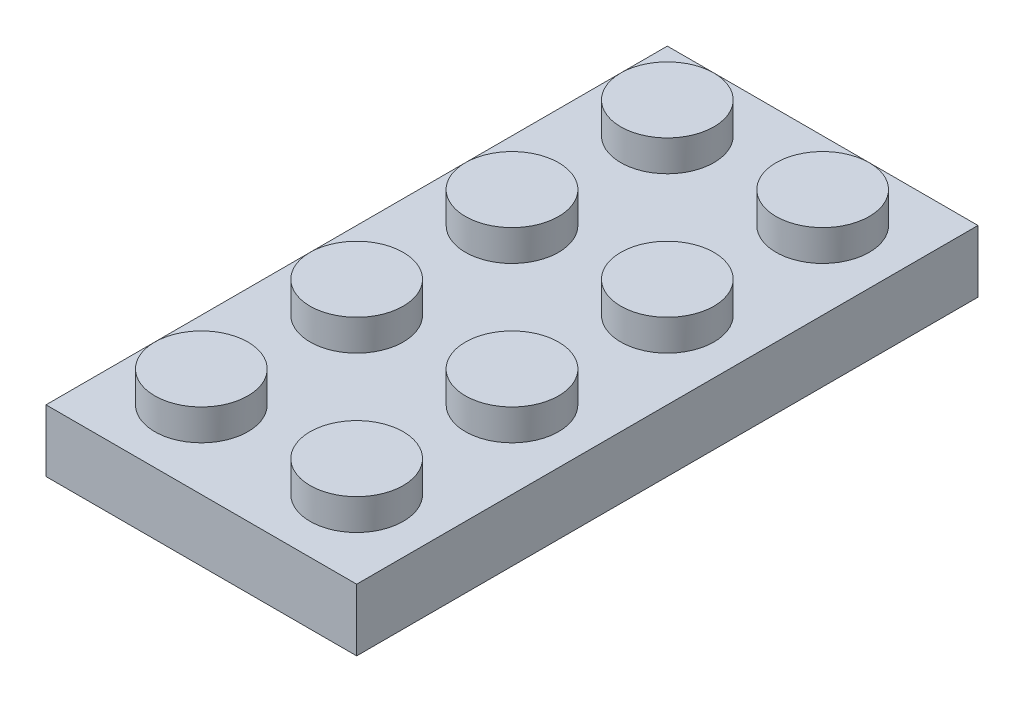
ISO-10303-21;
HEADER;
FILE_DESCRIPTION(('STEP AP214'),'2;1');
FILE_NAME('part.step','',(''),(''),'','','');
FILE_SCHEMA(('AUTOMOTIVE_DESIGN { 1 0 10303 214 1 1 1 1 }'));
ENDSEC;
DATA;
#1=APPLICATION_CONTEXT('core data for automotive mechanical design processes');
#2=APPLICATION_PROTOCOL_DEFINITION('international standard','automotive_design',2000,#1);
#3=PRODUCT_CONTEXT('',#1,'mechanical');
#4=PRODUCT('Part','Part','',(#3));
#5=PRODUCT_RELATED_PRODUCT_CATEGORY('part','',(#4));
#6=PRODUCT_DEFINITION_FORMATION('','',#4);
#7=PRODUCT_DEFINITION_CONTEXT('part definition',#1,'design');
#8=PRODUCT_DEFINITION('design','',#6,#7);
#9=PRODUCT_DEFINITION_SHAPE('','',#8);
#10=(LENGTH_UNIT() NAMED_UNIT(*) SI_UNIT(.MILLI.,.METRE.));
#11=(NAMED_UNIT(*) PLANE_ANGLE_UNIT() SI_UNIT($,.RADIAN.));
#12=(NAMED_UNIT(*) SI_UNIT($,.STERADIAN.) SOLID_ANGLE_UNIT());
#13=UNCERTAINTY_MEASURE_WITH_UNIT(LENGTH_MEASURE(1.E-05),#10,'distance_accuracy_value','');
#14=(GEOMETRIC_REPRESENTATION_CONTEXT(3) GLOBAL_UNCERTAINTY_ASSIGNED_CONTEXT((#13)) GLOBAL_UNIT_ASSIGNED_CONTEXT((#10,
#11,#12)) REPRESENTATION_CONTEXT('',''));
#15=CARTESIAN_POINT('',(0.,0.,0.));
#16=DIRECTION('',(0.,0.,1.));
#17=DIRECTION('',(1.,0.,0.));
#18=AXIS2_PLACEMENT_3D('',#15,#16,#17);
#19=CARTESIAN_POINT('',(0.,0.,0.));
#20=DIRECTION('',(0.,-1.,0.));
#21=DIRECTION('',(0.,0.,-1.));
#22=AXIS2_PLACEMENT_3D('',#19,#20,#21);
#23=PLANE('',#22);
#24=DIRECTION('',(0.,0.,1.));
#25=VECTOR('',#24,1.);
#26=CARTESIAN_POINT('',(0.,0.,0.));
#27=LINE('',#26,#25);
#28=CARTESIAN_POINT('',(0.,0.,-32.));
#29=VERTEX_POINT('',#28);
#30=CARTESIAN_POINT('',(0.,0.,0.));
#31=VERTEX_POINT('',#30);
#32=EDGE_CURVE('E224',#29,#31,#27,.T.);
#33=ORIENTED_EDGE('',*,*,#32,.F.);
#34=DIRECTION('',(-1.,0.,0.));
#35=VECTOR('',#34,1.);
#36=CARTESIAN_POINT('',(0.,0.,-32.));
#37=LINE('',#36,#35);
#38=CARTESIAN_POINT('',(16.,0.,-32.));
#39=VERTEX_POINT('',#38);
#40=EDGE_CURVE('E85',#39,#29,#37,.T.);
#41=ORIENTED_EDGE('',*,*,#40,.F.);
#42=DIRECTION('',(0.,0.,-1.));
#43=VECTOR('',#42,1.);
#44=CARTESIAN_POINT('',(16.,0.,0.));
#45=LINE('',#44,#43);
#46=CARTESIAN_POINT('',(16.,0.,0.));
#47=VERTEX_POINT('',#46);
#48=EDGE_CURVE('E242',#47,#39,#45,.T.);
#49=ORIENTED_EDGE('',*,*,#48,.F.);
#50=DIRECTION('',(1.,0.,0.));
#51=VECTOR('',#50,1.);
#52=CARTESIAN_POINT('',(0.,0.,0.));
#53=LINE('',#52,#51);
#54=EDGE_CURVE('E239',#31,#47,#53,.T.);
#55=ORIENTED_EDGE('',*,*,#54,.F.);
#56=EDGE_LOOP('',(#33,#41,#49,#55));
#57=FACE_BOUND('',#56,.T.);
#58=DIRECTION('',(-1.,0.,0.));
#59=VECTOR('',#58,1.);
#60=CARTESIAN_POINT('',(0.,0.,-30.4));
#61=LINE('',#60,#59);
#62=CARTESIAN_POINT('',(14.4,0.,-30.4));
#63=VERTEX_POINT('',#62);
#64=CARTESIAN_POINT('',(1.6,0.,-30.4));
#65=VERTEX_POINT('',#64);
#66=EDGE_CURVE('E207',#63,#65,#61,.T.);
#67=ORIENTED_EDGE('',*,*,#66,.T.);
#68=DIRECTION('',(0.,0.,1.));
#69=VECTOR('',#68,1.);
#70=CARTESIAN_POINT('',(1.6,0.,0.));
#71=LINE('',#70,#69);
#72=CARTESIAN_POINT('',(1.6,0.,-1.6));
#73=VERTEX_POINT('',#72);
#74=EDGE_CURVE('E198',#65,#73,#71,.T.);
#75=ORIENTED_EDGE('',*,*,#74,.T.);
#76=DIRECTION('',(1.,0.,0.));
#77=VECTOR('',#76,1.);
#78=CARTESIAN_POINT('',(0.,0.,-1.6));
#79=LINE('',#78,#77);
#80=CARTESIAN_POINT('',(14.4,0.,-1.6));
#81=VERTEX_POINT('',#80);
#82=EDGE_CURVE('E206',#73,#81,#79,.T.);
#83=ORIENTED_EDGE('',*,*,#82,.T.);
#84=DIRECTION('',(0.,0.,-1.));
#85=VECTOR('',#84,1.);
#86=CARTESIAN_POINT('',(14.4,0.,0.));
#87=LINE('',#86,#85);
#88=EDGE_CURVE('E55',#81,#63,#87,.T.);
#89=ORIENTED_EDGE('',*,*,#88,.T.);
#90=EDGE_LOOP('',(#67,#75,#83,#89));
#91=FACE_BOUND('',#90,.T.);
#92=ADVANCED_FACE('F39',(#57,#91),#23,.T.);
#93=CARTESIAN_POINT('',(4.,4.8,-28.));
#94=DIRECTION('',(0.,1.,0.));
#95=DIRECTION('',(0.,0.,1.));
#96=AXIS2_PLACEMENT_3D('',#93,#94,#95);
#97=PLANE('',#96);
#98=CARTESIAN_POINT('',(4.,4.8,-28.));
#99=DIRECTION('',(0.,1.,0.));
#100=DIRECTION('',(0.,0.,1.));
#101=AXIS2_PLACEMENT_3D('',#98,#99,#100);
#102=CIRCLE('',#101,2.4);
#103=CARTESIAN_POINT('',(4.,4.8,-25.6));
#104=VERTEX_POINT('',#103);
#105=EDGE_CURVE('E11',#104,#104,#102,.T.);
#106=ORIENTED_EDGE('',*,*,#105,.T.);
#107=EDGE_LOOP('',(#106));
#108=FACE_BOUND('',#107,.T.);
#109=ADVANCED_FACE('F41',(#108),#97,.T.);
#110=CARTESIAN_POINT('',(4.,4.8,-28.));
#111=DIRECTION('',(0.,-1.,0.));
#112=DIRECTION('',(0.,0.,-1.));
#113=AXIS2_PLACEMENT_3D('',#110,#111,#112);
#114=CYLINDRICAL_SURFACE('',#113,2.4);
#115=ORIENTED_EDGE('',*,*,#105,.F.);
#116=EDGE_LOOP('',(#115));
#117=FACE_BOUND('',#116,.T.);
#118=CARTESIAN_POINT('',(4.,3.2,-28.));
#119=DIRECTION('',(0.,-1.,0.));
#120=DIRECTION('',(0.,0.,-1.));
#121=AXIS2_PLACEMENT_3D('',#118,#119,#120);
#122=CIRCLE('',#121,2.4);
#123=CARTESIAN_POINT('',(4.,3.2,-30.4));
#124=VERTEX_POINT('',#123);
#125=EDGE_CURVE('E48',#124,#124,#122,.F.);
#126=ORIENTED_EDGE('',*,*,#125,.T.);
#127=EDGE_LOOP('',(#126));
#128=FACE_BOUND('',#127,.T.);
#129=ADVANCED_FACE('F310',(#117,#128),#114,.T.);
#130=CARTESIAN_POINT('',(12.,4.8,-28.));
#131=DIRECTION('',(0.,1.,0.));
#132=DIRECTION('',(0.,0.,1.));
#133=AXIS2_PLACEMENT_3D('',#130,#131,#132);
#134=PLANE('',#133);
#135=CARTESIAN_POINT('',(12.,4.8,-28.));
#136=DIRECTION('',(0.,1.,0.));
#137=DIRECTION('',(0.,0.,1.));
#138=AXIS2_PLACEMENT_3D('',#135,#136,#137);
#139=CIRCLE('',#138,2.4);
#140=CARTESIAN_POINT('',(12.,4.8,-25.6));
#141=VERTEX_POINT('',#140);
#142=EDGE_CURVE('E303',#141,#141,#139,.T.);
#143=ORIENTED_EDGE('',*,*,#142,.T.);
#144=EDGE_LOOP('',(#143));
#145=FACE_BOUND('',#144,.T.);
#146=ADVANCED_FACE('F384',(#145),#134,.T.);
#147=CARTESIAN_POINT('',(12.,4.8,-28.));
#148=DIRECTION('',(0.,-1.,0.));
#149=DIRECTION('',(0.,0.,-1.));
#150=AXIS2_PLACEMENT_3D('',#147,#148,#149);
#151=CYLINDRICAL_SURFACE('',#150,2.4);
#152=ORIENTED_EDGE('',*,*,#142,.F.);
#153=EDGE_LOOP('',(#152));
#154=FACE_BOUND('',#153,.T.);
#155=CARTESIAN_POINT('',(12.,3.2,-28.));
#156=DIRECTION('',(0.,-1.,0.));
#157=DIRECTION('',(0.,0.,-1.));
#158=AXIS2_PLACEMENT_3D('',#155,#156,#157);
#159=CIRCLE('',#158,2.4);
#160=CARTESIAN_POINT('',(12.,3.2,-30.4));
#161=VERTEX_POINT('',#160);
#162=EDGE_CURVE('E299',#161,#161,#159,.F.);
#163=ORIENTED_EDGE('',*,*,#162,.T.);
#164=EDGE_LOOP('',(#163));
#165=FACE_BOUND('',#164,.T.);
#166=ADVANCED_FACE('F380',(#154,#165),#151,.T.);
#167=CARTESIAN_POINT('',(4.,4.8,-20.));
#168=DIRECTION('',(0.,1.,0.));
#169=DIRECTION('',(0.,0.,1.));
#170=AXIS2_PLACEMENT_3D('',#167,#168,#169);
#171=PLANE('',#170);
#172=CARTESIAN_POINT('',(4.,4.8,-20.));
#173=DIRECTION('',(0.,1.,0.));
#174=DIRECTION('',(0.,0.,1.));
#175=AXIS2_PLACEMENT_3D('',#172,#173,#174);
#176=CIRCLE('',#175,2.4);
#177=CARTESIAN_POINT('',(4.,4.8,-17.6));
#178=VERTEX_POINT('',#177);
#179=EDGE_CURVE('E295',#178,#178,#176,.T.);
#180=ORIENTED_EDGE('',*,*,#179,.T.);
#181=EDGE_LOOP('',(#180));
#182=FACE_BOUND('',#181,.T.);
#183=ADVANCED_FACE('F376',(#182),#171,.T.);
#184=CARTESIAN_POINT('',(4.,4.8,-20.));
#185=DIRECTION('',(0.,-1.,0.));
#186=DIRECTION('',(0.,0.,-1.));
#187=AXIS2_PLACEMENT_3D('',#184,#185,#186);
#188=CYLINDRICAL_SURFACE('',#187,2.4);
#189=ORIENTED_EDGE('',*,*,#179,.F.);
#190=EDGE_LOOP('',(#189));
#191=FACE_BOUND('',#190,.T.);
#192=CARTESIAN_POINT('',(4.,3.2,-20.));
#193=DIRECTION('',(0.,-1.,0.));
#194=DIRECTION('',(0.,0.,-1.));
#195=AXIS2_PLACEMENT_3D('',#192,#193,#194);
#196=CIRCLE('',#195,2.4);
#197=CARTESIAN_POINT('',(4.,3.2,-22.4));
#198=VERTEX_POINT('',#197);
#199=EDGE_CURVE('E291',#198,#198,#196,.F.);
#200=ORIENTED_EDGE('',*,*,#199,.T.);
#201=EDGE_LOOP('',(#200));
#202=FACE_BOUND('',#201,.T.);
#203=ADVANCED_FACE('F372',(#191,#202),#188,.T.);
#204=CARTESIAN_POINT('',(12.,4.8,-20.));
#205=DIRECTION('',(0.,1.,0.));
#206=DIRECTION('',(0.,0.,1.));
#207=AXIS2_PLACEMENT_3D('',#204,#205,#206);
#208=PLANE('',#207);
#209=CARTESIAN_POINT('',(12.,4.8,-20.));
#210=DIRECTION('',(0.,1.,0.));
#211=DIRECTION('',(0.,0.,1.));
#212=AXIS2_PLACEMENT_3D('',#209,#210,#211);
#213=CIRCLE('',#212,2.4);
#214=CARTESIAN_POINT('',(12.,4.8,-17.6));
#215=VERTEX_POINT('',#214);
#216=EDGE_CURVE('E287',#215,#215,#213,.T.);
#217=ORIENTED_EDGE('',*,*,#216,.T.);
#218=EDGE_LOOP('',(#217));
#219=FACE_BOUND('',#218,.T.);
#220=ADVANCED_FACE('F368',(#219),#208,.T.);
#221=CARTESIAN_POINT('',(12.,4.8,-20.));
#222=DIRECTION('',(0.,-1.,0.));
#223=DIRECTION('',(0.,0.,-1.));
#224=AXIS2_PLACEMENT_3D('',#221,#222,#223);
#225=CYLINDRICAL_SURFACE('',#224,2.4);
#226=ORIENTED_EDGE('',*,*,#216,.F.);
#227=EDGE_LOOP('',(#226));
#228=FACE_BOUND('',#227,.T.);
#229=CARTESIAN_POINT('',(12.,3.2,-20.));
#230=DIRECTION('',(0.,-1.,0.));
#231=DIRECTION('',(0.,0.,-1.));
#232=AXIS2_PLACEMENT_3D('',#229,#230,#231);
#233=CIRCLE('',#232,2.4);
#234=CARTESIAN_POINT('',(12.,3.2,-22.4));
#235=VERTEX_POINT('',#234);
#236=EDGE_CURVE('E283',#235,#235,#233,.F.);
#237=ORIENTED_EDGE('',*,*,#236,.T.);
#238=EDGE_LOOP('',(#237));
#239=FACE_BOUND('',#238,.T.);
#240=ADVANCED_FACE('F364',(#228,#239),#225,.T.);
#241=CARTESIAN_POINT('',(4.,4.8,-12.));
#242=DIRECTION('',(0.,1.,0.));
#243=DIRECTION('',(0.,0.,1.));
#244=AXIS2_PLACEMENT_3D('',#241,#242,#243);
#245=PLANE('',#244);
#246=CARTESIAN_POINT('',(4.,4.8,-12.));
#247=DIRECTION('',(0.,1.,0.));
#248=DIRECTION('',(0.,0.,1.));
#249=AXIS2_PLACEMENT_3D('',#246,#247,#248);
#250=CIRCLE('',#249,2.4);
#251=CARTESIAN_POINT('',(4.,4.8,-9.6));
#252=VERTEX_POINT('',#251);
#253=EDGE_CURVE('E279',#252,#252,#250,.T.);
#254=ORIENTED_EDGE('',*,*,#253,.T.);
#255=EDGE_LOOP('',(#254));
#256=FACE_BOUND('',#255,.T.);
#257=ADVANCED_FACE('F360',(#256),#245,.T.);
#258=CARTESIAN_POINT('',(4.,4.8,-12.));
#259=DIRECTION('',(0.,-1.,0.));
#260=DIRECTION('',(0.,0.,-1.));
#261=AXIS2_PLACEMENT_3D('',#258,#259,#260);
#262=CYLINDRICAL_SURFACE('',#261,2.4);
#263=ORIENTED_EDGE('',*,*,#253,.F.);
#264=EDGE_LOOP('',(#263));
#265=FACE_BOUND('',#264,.T.);
#266=CARTESIAN_POINT('',(4.,3.2,-12.));
#267=DIRECTION('',(0.,-1.,0.));
#268=DIRECTION('',(0.,0.,-1.));
#269=AXIS2_PLACEMENT_3D('',#266,#267,#268);
#270=CIRCLE('',#269,2.4);
#271=CARTESIAN_POINT('',(4.,3.2,-14.4));
#272=VERTEX_POINT('',#271);
#273=EDGE_CURVE('E275',#272,#272,#270,.F.);
#274=ORIENTED_EDGE('',*,*,#273,.T.);
#275=EDGE_LOOP('',(#274));
#276=FACE_BOUND('',#275,.T.);
#277=ADVANCED_FACE('F356',(#265,#276),#262,.T.);
#278=CARTESIAN_POINT('',(12.,4.8,-12.));
#279=DIRECTION('',(0.,1.,0.));
#280=DIRECTION('',(0.,0.,1.));
#281=AXIS2_PLACEMENT_3D('',#278,#279,#280);
#282=PLANE('',#281);
#283=CARTESIAN_POINT('',(12.,4.8,-12.));
#284=DIRECTION('',(0.,1.,0.));
#285=DIRECTION('',(0.,0.,1.));
#286=AXIS2_PLACEMENT_3D('',#283,#284,#285);
#287=CIRCLE('',#286,2.4);
#288=CARTESIAN_POINT('',(12.,4.8,-9.6));
#289=VERTEX_POINT('',#288);
#290=EDGE_CURVE('E271',#289,#289,#287,.T.);
#291=ORIENTED_EDGE('',*,*,#290,.T.);
#292=EDGE_LOOP('',(#291));
#293=FACE_BOUND('',#292,.T.);
#294=ADVANCED_FACE('F352',(#293),#282,.T.);
#295=CARTESIAN_POINT('',(12.,4.8,-12.));
#296=DIRECTION('',(0.,-1.,0.));
#297=DIRECTION('',(0.,0.,-1.));
#298=AXIS2_PLACEMENT_3D('',#295,#296,#297);
#299=CYLINDRICAL_SURFACE('',#298,2.4);
#300=ORIENTED_EDGE('',*,*,#290,.F.);
#301=EDGE_LOOP('',(#300));
#302=FACE_BOUND('',#301,.T.);
#303=CARTESIAN_POINT('',(12.,3.2,-12.));
#304=DIRECTION('',(0.,-1.,0.));
#305=DIRECTION('',(0.,0.,-1.));
#306=AXIS2_PLACEMENT_3D('',#303,#304,#305);
#307=CIRCLE('',#306,2.4);
#308=CARTESIAN_POINT('',(12.,3.2,-14.4));
#309=VERTEX_POINT('',#308);
#310=EDGE_CURVE('E267',#309,#309,#307,.F.);
#311=ORIENTED_EDGE('',*,*,#310,.T.);
#312=EDGE_LOOP('',(#311));
#313=FACE_BOUND('',#312,.T.);
#314=ADVANCED_FACE('F348',(#302,#313),#299,.T.);
#315=CARTESIAN_POINT('',(0.,3.2,0.));
#316=DIRECTION('',(1.,0.,0.));
#317=DIRECTION('',(0.,0.,-1.));
#318=AXIS2_PLACEMENT_3D('',#315,#316,#317);
#319=PLANE('',#318);
#320=ORIENTED_EDGE('',*,*,#32,.T.);
#321=DIRECTION('',(0.,-1.,0.));
#322=VECTOR('',#321,1.);
#323=CARTESIAN_POINT('',(0.,3.2,0.));
#324=LINE('',#323,#322);
#325=CARTESIAN_POINT('',(0.,3.2,0.));
#326=VERTEX_POINT('',#325);
#327=EDGE_CURVE('E256',#326,#31,#324,.T.);
#328=ORIENTED_EDGE('',*,*,#327,.F.);
#329=DIRECTION('',(0.,0.,1.));
#330=VECTOR('',#329,1.);
#331=CARTESIAN_POINT('',(0.,3.2,0.));
#332=LINE('',#331,#330);
#333=CARTESIAN_POINT('',(0.,3.2,-32.));
#334=VERTEX_POINT('',#333);
#335=EDGE_CURVE('E225',#334,#326,#332,.T.);
#336=ORIENTED_EDGE('',*,*,#335,.F.);
#337=DIRECTION('',(0.,-1.,0.));
#338=VECTOR('',#337,1.);
#339=CARTESIAN_POINT('',(0.,3.2,-32.));
#340=LINE('',#339,#338);
#341=EDGE_CURVE('E235',#334,#29,#340,.T.);
#342=ORIENTED_EDGE('',*,*,#341,.T.);
#343=EDGE_LOOP('',(#320,#328,#336,#342));
#344=FACE_BOUND('',#343,.T.);
#345=ADVANCED_FACE('F345',(#344),#319,.F.);
#346=CARTESIAN_POINT('',(0.,3.2,0.));
#347=DIRECTION('',(0.,0.,-1.));
#348=DIRECTION('',(-1.,0.,0.));
#349=AXIS2_PLACEMENT_3D('',#346,#347,#348);
#350=PLANE('',#349);
#351=ORIENTED_EDGE('',*,*,#54,.T.);
#352=DIRECTION('',(0.,-1.,0.));
#353=VECTOR('',#352,1.);
#354=CARTESIAN_POINT('',(16.,3.2,0.));
#355=LINE('',#354,#353);
#356=CARTESIAN_POINT('',(16.,3.2,0.));
#357=VERTEX_POINT('',#356);
#358=EDGE_CURVE('E252',#357,#47,#355,.T.);
#359=ORIENTED_EDGE('',*,*,#358,.F.);
#360=DIRECTION('',(1.,0.,0.));
#361=VECTOR('',#360,1.);
#362=CARTESIAN_POINT('',(0.,3.2,0.));
#363=LINE('',#362,#361);
#364=EDGE_CURVE('E93',#326,#357,#363,.T.);
#365=ORIENTED_EDGE('',*,*,#364,.F.);
#366=ORIENTED_EDGE('',*,*,#327,.T.);
#367=EDGE_LOOP('',(#351,#359,#365,#366));
#368=FACE_BOUND('',#367,.T.);
#369=ADVANCED_FACE('F341',(#368),#350,.F.);
#370=CARTESIAN_POINT('',(16.,3.2,0.));
#371=DIRECTION('',(-1.,0.,0.));
#372=DIRECTION('',(0.,0.,1.));
#373=AXIS2_PLACEMENT_3D('',#370,#371,#372);
#374=PLANE('',#373);
#375=ORIENTED_EDGE('',*,*,#48,.T.);
#376=DIRECTION('',(0.,-1.,0.));
#377=VECTOR('',#376,1.);
#378=CARTESIAN_POINT('',(16.,3.2,-32.));
#379=LINE('',#378,#377);
#380=CARTESIAN_POINT('',(16.,3.2,-32.));
#381=VERTEX_POINT('',#380);
#382=EDGE_CURVE('E249',#381,#39,#379,.T.);
#383=ORIENTED_EDGE('',*,*,#382,.F.);
#384=DIRECTION('',(0.,0.,-1.));
#385=VECTOR('',#384,1.);
#386=CARTESIAN_POINT('',(16.,3.2,0.));
#387=LINE('',#386,#385);
#388=EDGE_CURVE('E230',#357,#381,#387,.T.);
#389=ORIENTED_EDGE('',*,*,#388,.F.);
#390=ORIENTED_EDGE('',*,*,#358,.T.);
#391=EDGE_LOOP('',(#375,#383,#389,#390));
#392=FACE_BOUND('',#391,.T.);
#393=ADVANCED_FACE('F325',(#392),#374,.F.);
#394=CARTESIAN_POINT('',(0.,3.2,-32.));
#395=DIRECTION('',(0.,0.,1.));
#396=DIRECTION('',(1.,0.,0.));
#397=AXIS2_PLACEMENT_3D('',#394,#395,#396);
#398=PLANE('',#397);
#399=ORIENTED_EDGE('',*,*,#40,.T.);
#400=ORIENTED_EDGE('',*,*,#341,.F.);
#401=DIRECTION('',(-1.,0.,0.));
#402=VECTOR('',#401,1.);
#403=CARTESIAN_POINT('',(0.,3.2,-32.));
#404=LINE('',#403,#402);
#405=EDGE_CURVE('E64',#381,#334,#404,.T.);
#406=ORIENTED_EDGE('',*,*,#405,.F.);
#407=ORIENTED_EDGE('',*,*,#382,.T.);
#408=EDGE_LOOP('',(#399,#400,#406,#407));
#409=FACE_BOUND('',#408,.T.);
#410=ADVANCED_FACE('F315',(#409),#398,.F.);
#411=CARTESIAN_POINT('',(0.,3.2,0.));
#412=DIRECTION('',(0.,-1.,0.));
#413=DIRECTION('',(0.,0.,-1.));
#414=AXIS2_PLACEMENT_3D('',#411,#412,#413);
#415=PLANE('',#414);
#416=CARTESIAN_POINT('',(4.,3.2,-4.));
#417=DIRECTION('',(0.,-1.,0.));
#418=DIRECTION('',(0.,0.,-1.));
#419=AXIS2_PLACEMENT_3D('',#416,#417,#418);
#420=CIRCLE('',#419,2.4);
#421=CARTESIAN_POINT('',(4.,3.2,-6.4));
#422=VERTEX_POINT('',#421);
#423=EDGE_CURVE('E263',#422,#422,#420,.F.);
#424=ORIENTED_EDGE('',*,*,#423,.F.);
#425=EDGE_LOOP('',(#424));
#426=FACE_BOUND('',#425,.T.);
#427=CARTESIAN_POINT('',(12.,3.2,-4.));
#428=DIRECTION('',(0.,-1.,0.));
#429=DIRECTION('',(0.,0.,-1.));
#430=AXIS2_PLACEMENT_3D('',#427,#428,#429);
#431=CIRCLE('',#430,2.4);
#432=CARTESIAN_POINT('',(12.,3.2,-6.4));
#433=VERTEX_POINT('',#432);
#434=EDGE_CURVE('E259',#433,#433,#431,.F.);
#435=ORIENTED_EDGE('',*,*,#434,.F.);
#436=EDGE_LOOP('',(#435));
#437=FACE_BOUND('',#436,.T.);
#438=ORIENTED_EDGE('',*,*,#335,.T.);
#439=ORIENTED_EDGE('',*,*,#364,.T.);
#440=ORIENTED_EDGE('',*,*,#388,.T.);
#441=ORIENTED_EDGE('',*,*,#405,.T.);
#442=EDGE_LOOP('',(#438,#439,#440,#441));
#443=FACE_BOUND('',#442,.T.);
#444=ORIENTED_EDGE('',*,*,#310,.F.);
#445=EDGE_LOOP('',(#444));
#446=FACE_BOUND('',#445,.T.);
#447=ORIENTED_EDGE('',*,*,#273,.F.);
#448=EDGE_LOOP('',(#447));
#449=FACE_BOUND('',#448,.T.);
#450=ORIENTED_EDGE('',*,*,#236,.F.);
#451=EDGE_LOOP('',(#450));
#452=FACE_BOUND('',#451,.T.);
#453=ORIENTED_EDGE('',*,*,#199,.F.);
#454=EDGE_LOOP('',(#453));
#455=FACE_BOUND('',#454,.T.);
#456=ORIENTED_EDGE('',*,*,#162,.F.);
#457=EDGE_LOOP('',(#456));
#458=FACE_BOUND('',#457,.T.);
#459=ORIENTED_EDGE('',*,*,#125,.F.);
#460=EDGE_LOOP('',(#459));
#461=FACE_BOUND('',#460,.T.);
#462=ADVANCED_FACE('F312',(#426,#437,#443,#446,#449,#452,#455,#458,#461),#415,.F.);
#463=CARTESIAN_POINT('',(12.,4.8,-4.));
#464=DIRECTION('',(0.,-1.,0.));
#465=DIRECTION('',(0.,0.,-1.));
#466=AXIS2_PLACEMENT_3D('',#463,#464,#465);
#467=CYLINDRICAL_SURFACE('',#466,2.4);
#468=CARTESIAN_POINT('',(12.,4.8,-4.));
#469=DIRECTION('',(0.,1.,0.));
#470=DIRECTION('',(0.,0.,1.));
#471=AXIS2_PLACEMENT_3D('',#468,#469,#470);
#472=CIRCLE('',#471,2.4);
#473=CARTESIAN_POINT('',(12.,4.8,-1.6));
#474=VERTEX_POINT('',#473);
#475=EDGE_CURVE('E219',#474,#474,#472,.T.);
#476=ORIENTED_EDGE('',*,*,#475,.F.);
#477=EDGE_LOOP('',(#476));
#478=FACE_BOUND('',#477,.T.);
#479=ORIENTED_EDGE('',*,*,#434,.T.);
#480=EDGE_LOOP('',(#479));
#481=FACE_BOUND('',#480,.T.);
#482=ADVANCED_FACE('F314',(#478,#481),#467,.T.);
#483=CARTESIAN_POINT('',(12.,4.8,-4.));
#484=DIRECTION('',(0.,1.,0.));
#485=DIRECTION('',(0.,0.,1.));
#486=AXIS2_PLACEMENT_3D('',#483,#484,#485);
#487=PLANE('',#486);
#488=ORIENTED_EDGE('',*,*,#475,.T.);
#489=EDGE_LOOP('',(#488));
#490=FACE_BOUND('',#489,.T.);
#491=ADVANCED_FACE('F322',(#490),#487,.T.);
#492=CARTESIAN_POINT('',(4.,4.8,-4.));
#493=DIRECTION('',(0.,-1.,0.));
#494=DIRECTION('',(0.,0.,-1.));
#495=AXIS2_PLACEMENT_3D('',#492,#493,#494);
#496=CYLINDRICAL_SURFACE('',#495,2.4);
#497=CARTESIAN_POINT('',(4.,4.8,-4.));
#498=DIRECTION('',(0.,1.,0.));
#499=DIRECTION('',(0.,0.,1.));
#500=AXIS2_PLACEMENT_3D('',#497,#498,#499);
#501=CIRCLE('',#500,2.4);
#502=CARTESIAN_POINT('',(4.,4.8,-1.6));
#503=VERTEX_POINT('',#502);
#504=EDGE_CURVE('E215',#503,#503,#501,.T.);
#505=ORIENTED_EDGE('',*,*,#504,.F.);
#506=EDGE_LOOP('',(#505));
#507=FACE_BOUND('',#506,.T.);
#508=ORIENTED_EDGE('',*,*,#423,.T.);
#509=EDGE_LOOP('',(#508));
#510=FACE_BOUND('',#509,.T.);
#511=ADVANCED_FACE('F466',(#507,#510),#496,.T.);
#512=CARTESIAN_POINT('',(4.,4.8,-4.));
#513=DIRECTION('',(0.,1.,0.));
#514=DIRECTION('',(0.,0.,1.));
#515=AXIS2_PLACEMENT_3D('',#512,#513,#514);
#516=PLANE('',#515);
#517=ORIENTED_EDGE('',*,*,#504,.T.);
#518=EDGE_LOOP('',(#517));
#519=FACE_BOUND('',#518,.T.);
#520=ADVANCED_FACE('F504',(#519),#516,.T.);
#521=CARTESIAN_POINT('',(4.,3.2,-28.));
#522=DIRECTION('',(0.,1.,0.));
#523=DIRECTION('',(0.,0.,1.));
#524=AXIS2_PLACEMENT_3D('',#521,#522,#523);
#525=PLANE('',#524);
#526=CARTESIAN_POINT('',(4.,3.2,-28.));
#527=DIRECTION('',(0.,1.,0.));
#528=DIRECTION('',(0.,0.,1.));
#529=AXIS2_PLACEMENT_3D('',#526,#527,#528);
#530=CIRCLE('',#529,0.799999999999999);
#531=CARTESIAN_POINT('',(4.,3.2,-27.2));
#532=VERTEX_POINT('',#531);
#533=EDGE_CURVE('E220',#532,#532,#530,.T.);
#534=ORIENTED_EDGE('',*,*,#533,.F.);
#535=EDGE_LOOP('',(#534));
#536=FACE_BOUND('',#535,.T.);
#537=ADVANCED_FACE('F513',(#536),#525,.F.);
#538=CARTESIAN_POINT('',(4.,4.8,-28.));
#539=DIRECTION('',(0.,-1.,0.));
#540=DIRECTION('',(0.,0.,-1.));
#541=AXIS2_PLACEMENT_3D('',#538,#539,#540);
#542=CYLINDRICAL_SURFACE('',#541,0.799999999999999);
#543=ORIENTED_EDGE('',*,*,#533,.T.);
#544=EDGE_LOOP('',(#543));
#545=FACE_BOUND('',#544,.T.);
#546=CARTESIAN_POINT('',(4.,1.6,-28.));
#547=DIRECTION('',(0.,-1.,0.));
#548=DIRECTION('',(0.,0.,-1.));
#549=AXIS2_PLACEMENT_3D('',#546,#547,#548);
#550=CIRCLE('',#549,0.799999999999999);
#551=CARTESIAN_POINT('',(4.,1.6,-28.8));
#552=VERTEX_POINT('',#551);
#553=EDGE_CURVE('E174',#552,#552,#550,.F.);
#554=ORIENTED_EDGE('',*,*,#553,.F.);
#555=EDGE_LOOP('',(#554));
#556=FACE_BOUND('',#555,.T.);
#557=ADVANCED_FACE('F526',(#545,#556),#542,.F.);
#558=CARTESIAN_POINT('',(12.,3.2,-28.));
#559=DIRECTION('',(0.,1.,0.));
#560=DIRECTION('',(0.,0.,1.));
#561=AXIS2_PLACEMENT_3D('',#558,#559,#560);
#562=PLANE('',#561);
#563=CARTESIAN_POINT('',(12.,3.2,-28.));
#564=DIRECTION('',(0.,1.,0.));
#565=DIRECTION('',(0.,0.,1.));
#566=AXIS2_PLACEMENT_3D('',#563,#564,#565);
#567=CIRCLE('',#566,0.799999999999999);
#568=CARTESIAN_POINT('',(12.,3.2,-27.2));
#569=VERTEX_POINT('',#568);
#570=EDGE_CURVE('E170',#569,#569,#567,.T.);
#571=ORIENTED_EDGE('',*,*,#570,.F.);
#572=EDGE_LOOP('',(#571));
#573=FACE_BOUND('',#572,.T.);
#574=ADVANCED_FACE('F535',(#573),#562,.F.);
#575=CARTESIAN_POINT('',(12.,4.8,-28.));
#576=DIRECTION('',(0.,-1.,0.));
#577=DIRECTION('',(0.,0.,-1.));
#578=AXIS2_PLACEMENT_3D('',#575,#576,#577);
#579=CYLINDRICAL_SURFACE('',#578,0.799999999999999);
#580=ORIENTED_EDGE('',*,*,#570,.T.);
#581=EDGE_LOOP('',(#580));
#582=FACE_BOUND('',#581,.T.);
#583=CARTESIAN_POINT('',(12.,1.6,-28.));
#584=DIRECTION('',(0.,-1.,0.));
#585=DIRECTION('',(0.,0.,-1.));
#586=AXIS2_PLACEMENT_3D('',#583,#584,#585);
#587=CIRCLE('',#586,0.799999999999999);
#588=CARTESIAN_POINT('',(12.,1.6,-28.8));
#589=VERTEX_POINT('',#588);
#590=EDGE_CURVE('E166',#589,#589,#587,.F.);
#591=ORIENTED_EDGE('',*,*,#590,.F.);
#592=EDGE_LOOP('',(#591));
#593=FACE_BOUND('',#592,.T.);
#594=ADVANCED_FACE('F544',(#582,#593),#579,.F.);
#595=CARTESIAN_POINT('',(4.,3.2,-20.));
#596=DIRECTION('',(0.,1.,0.));
#597=DIRECTION('',(0.,0.,1.));
#598=AXIS2_PLACEMENT_3D('',#595,#596,#597);
#599=PLANE('',#598);
#600=CARTESIAN_POINT('',(4.,3.2,-20.));
#601=DIRECTION('',(0.,1.,0.));
#602=DIRECTION('',(0.,0.,1.));
#603=AXIS2_PLACEMENT_3D('',#600,#601,#602);
#604=CIRCLE('',#603,0.799999999999999);
#605=CARTESIAN_POINT('',(4.,3.2,-19.2));
#606=VERTEX_POINT('',#605);
#607=EDGE_CURVE('E165',#606,#606,#604,.T.);
#608=ORIENTED_EDGE('',*,*,#607,.F.);
#609=EDGE_LOOP('',(#608));
#610=FACE_BOUND('',#609,.T.);
#611=ADVANCED_FACE('F553',(#610),#599,.F.);
#612=CARTESIAN_POINT('',(4.,4.8,-20.));
#613=DIRECTION('',(0.,-1.,0.));
#614=DIRECTION('',(0.,0.,-1.));
#615=AXIS2_PLACEMENT_3D('',#612,#613,#614);
#616=CYLINDRICAL_SURFACE('',#615,0.799999999999999);
#617=ORIENTED_EDGE('',*,*,#607,.T.);
#618=EDGE_LOOP('',(#617));
#619=FACE_BOUND('',#618,.T.);
#620=CARTESIAN_POINT('',(4.,1.6,-20.));
#621=DIRECTION('',(0.,-1.,0.));
#622=DIRECTION('',(0.,0.,-1.));
#623=AXIS2_PLACEMENT_3D('',#620,#621,#622);
#624=CIRCLE('',#623,0.799999999999999);
#625=CARTESIAN_POINT('',(4.,1.6,-20.8));
#626=VERTEX_POINT('',#625);
#627=EDGE_CURVE('E161',#626,#626,#624,.F.);
#628=ORIENTED_EDGE('',*,*,#627,.F.);
#629=EDGE_LOOP('',(#628));
#630=FACE_BOUND('',#629,.T.);
#631=ADVANCED_FACE('F562',(#619,#630),#616,.F.);
#632=CARTESIAN_POINT('',(12.,3.2,-20.));
#633=DIRECTION('',(0.,1.,0.));
#634=DIRECTION('',(0.,0.,1.));
#635=AXIS2_PLACEMENT_3D('',#632,#633,#634);
#636=PLANE('',#635);
#637=CARTESIAN_POINT('',(12.,3.2,-20.));
#638=DIRECTION('',(0.,1.,0.));
#639=DIRECTION('',(0.,0.,1.));
#640=AXIS2_PLACEMENT_3D('',#637,#638,#639);
#641=CIRCLE('',#640,0.799999999999999);
#642=CARTESIAN_POINT('',(12.,3.2,-19.2));
#643=VERTEX_POINT('',#642);
#644=EDGE_CURVE('E160',#643,#643,#641,.T.);
#645=ORIENTED_EDGE('',*,*,#644,.F.);
#646=EDGE_LOOP('',(#645));
#647=FACE_BOUND('',#646,.T.);
#648=ADVANCED_FACE('F571',(#647),#636,.F.);
#649=CARTESIAN_POINT('',(12.,4.8,-20.));
#650=DIRECTION('',(0.,-1.,0.));
#651=DIRECTION('',(0.,0.,-1.));
#652=AXIS2_PLACEMENT_3D('',#649,#650,#651);
#653=CYLINDRICAL_SURFACE('',#652,0.799999999999999);
#654=ORIENTED_EDGE('',*,*,#644,.T.);
#655=EDGE_LOOP('',(#654));
#656=FACE_BOUND('',#655,.T.);
#657=CARTESIAN_POINT('',(12.,1.6,-20.));
#658=DIRECTION('',(0.,-1.,0.));
#659=DIRECTION('',(0.,0.,-1.));
#660=AXIS2_PLACEMENT_3D('',#657,#658,#659);
#661=CIRCLE('',#660,0.799999999999999);
#662=CARTESIAN_POINT('',(12.,1.6,-20.8));
#663=VERTEX_POINT('',#662);
#664=EDGE_CURVE('E156',#663,#663,#661,.F.);
#665=ORIENTED_EDGE('',*,*,#664,.F.);
#666=EDGE_LOOP('',(#665));
#667=FACE_BOUND('',#666,.T.);
#668=ADVANCED_FACE('F580',(#656,#667),#653,.F.);
#669=CARTESIAN_POINT('',(4.,3.2,-12.));
#670=DIRECTION('',(0.,1.,0.));
#671=DIRECTION('',(0.,0.,1.));
#672=AXIS2_PLACEMENT_3D('',#669,#670,#671);
#673=PLANE('',#672);
#674=CARTESIAN_POINT('',(4.,3.2,-12.));
#675=DIRECTION('',(0.,1.,0.));
#676=DIRECTION('',(0.,0.,1.));
#677=AXIS2_PLACEMENT_3D('',#674,#675,#676);
#678=CIRCLE('',#677,0.799999999999999);
#679=CARTESIAN_POINT('',(4.,3.2,-11.2));
#680=VERTEX_POINT('',#679);
#681=EDGE_CURVE('E155',#680,#680,#678,.T.);
#682=ORIENTED_EDGE('',*,*,#681,.F.);
#683=EDGE_LOOP('',(#682));
#684=FACE_BOUND('',#683,.T.);
#685=ADVANCED_FACE('F589',(#684),#673,.F.);
#686=CARTESIAN_POINT('',(4.,4.8,-12.));
#687=DIRECTION('',(0.,-1.,0.));
#688=DIRECTION('',(0.,0.,-1.));
#689=AXIS2_PLACEMENT_3D('',#686,#687,#688);
#690=CYLINDRICAL_SURFACE('',#689,0.799999999999999);
#691=ORIENTED_EDGE('',*,*,#681,.T.);
#692=EDGE_LOOP('',(#691));
#693=FACE_BOUND('',#692,.T.);
#694=CARTESIAN_POINT('',(4.,1.6,-12.));
#695=DIRECTION('',(0.,-1.,0.));
#696=DIRECTION('',(0.,0.,-1.));
#697=AXIS2_PLACEMENT_3D('',#694,#695,#696);
#698=CIRCLE('',#697,0.799999999999999);
#699=CARTESIAN_POINT('',(4.,1.6,-12.8));
#700=VERTEX_POINT('',#699);
#701=EDGE_CURVE('E151',#700,#700,#698,.F.);
#702=ORIENTED_EDGE('',*,*,#701,.F.);
#703=EDGE_LOOP('',(#702));
#704=FACE_BOUND('',#703,.T.);
#705=ADVANCED_FACE('F598',(#693,#704),#690,.F.);
#706=CARTESIAN_POINT('',(12.,3.2,-12.));
#707=DIRECTION('',(0.,1.,0.));
#708=DIRECTION('',(0.,0.,1.));
#709=AXIS2_PLACEMENT_3D('',#706,#707,#708);
#710=PLANE('',#709);
#711=CARTESIAN_POINT('',(12.,3.2,-12.));
#712=DIRECTION('',(0.,1.,0.));
#713=DIRECTION('',(0.,0.,1.));
#714=AXIS2_PLACEMENT_3D('',#711,#712,#713);
#715=CIRCLE('',#714,0.799999999999999);
#716=CARTESIAN_POINT('',(12.,3.2,-11.2));
#717=VERTEX_POINT('',#716);
#718=EDGE_CURVE('E149',#717,#717,#715,.T.);
#719=ORIENTED_EDGE('',*,*,#718,.F.);
#720=EDGE_LOOP('',(#719));
#721=FACE_BOUND('',#720,.T.);
#722=ADVANCED_FACE('F607',(#721),#710,.F.);
#723=CARTESIAN_POINT('',(12.,4.8,-12.));
#724=DIRECTION('',(0.,-1.,0.));
#725=DIRECTION('',(0.,0.,-1.));
#726=AXIS2_PLACEMENT_3D('',#723,#724,#725);
#727=CYLINDRICAL_SURFACE('',#726,0.799999999999999);
#728=ORIENTED_EDGE('',*,*,#718,.T.);
#729=EDGE_LOOP('',(#728));
#730=FACE_BOUND('',#729,.T.);
#731=CARTESIAN_POINT('',(12.,1.6,-12.));
#732=DIRECTION('',(0.,-1.,0.));
#733=DIRECTION('',(0.,0.,-1.));
#734=AXIS2_PLACEMENT_3D('',#731,#732,#733);
#735=CIRCLE('',#734,0.799999999999999);
#736=CARTESIAN_POINT('',(12.,1.6,-12.8));
#737=VERTEX_POINT('',#736);
#738=EDGE_CURVE('E145',#737,#737,#735,.F.);
#739=ORIENTED_EDGE('',*,*,#738,.F.);
#740=EDGE_LOOP('',(#739));
#741=FACE_BOUND('',#740,.T.);
#742=ADVANCED_FACE('F616',(#730,#741),#727,.F.);
#743=CARTESIAN_POINT('',(1.6,3.2,0.));
#744=DIRECTION('',(1.,0.,0.));
#745=DIRECTION('',(0.,0.,-1.));
#746=AXIS2_PLACEMENT_3D('',#743,#744,#745);
#747=PLANE('',#746);
#748=ORIENTED_EDGE('',*,*,#74,.F.);
#749=DIRECTION('',(0.,-1.,0.));
#750=VECTOR('',#749,1.);
#751=CARTESIAN_POINT('',(1.6,3.2,-30.4));
#752=LINE('',#751,#750);
#753=CARTESIAN_POINT('',(1.6,1.6,-30.4));
#754=VERTEX_POINT('',#753);
#755=EDGE_CURVE('E141',#754,#65,#752,.T.);
#756=ORIENTED_EDGE('',*,*,#755,.F.);
#757=DIRECTION('',(0.,0.,1.));
#758=VECTOR('',#757,1.);
#759=CARTESIAN_POINT('',(1.6,1.6,0.));
#760=LINE('',#759,#758);
#761=CARTESIAN_POINT('',(1.6,1.6,-1.6));
#762=VERTEX_POINT('',#761);
#763=EDGE_CURVE('E127',#754,#762,#760,.T.);
#764=ORIENTED_EDGE('',*,*,#763,.T.);
#765=DIRECTION('',(0.,-1.,0.));
#766=VECTOR('',#765,1.);
#767=CARTESIAN_POINT('',(1.6,3.2,-1.6));
#768=LINE('',#767,#766);
#769=EDGE_CURVE('E120',#762,#73,#768,.T.);
#770=ORIENTED_EDGE('',*,*,#769,.T.);
#771=EDGE_LOOP('',(#748,#756,#764,#770));
#772=FACE_BOUND('',#771,.T.);
#773=ADVANCED_FACE('F625',(#772),#747,.T.);
#774=CARTESIAN_POINT('',(0.,3.2,-1.6));
#775=DIRECTION('',(0.,0.,-1.));
#776=DIRECTION('',(-1.,0.,0.));
#777=AXIS2_PLACEMENT_3D('',#774,#775,#776);
#778=PLANE('',#777);
#779=ORIENTED_EDGE('',*,*,#82,.F.);
#780=ORIENTED_EDGE('',*,*,#769,.F.);
#781=DIRECTION('',(1.,0.,0.));
#782=VECTOR('',#781,1.);
#783=CARTESIAN_POINT('',(0.,1.6,-1.6));
#784=LINE('',#783,#782);
#785=CARTESIAN_POINT('',(14.4,1.6,-1.6));
#786=VERTEX_POINT('',#785);
#787=EDGE_CURVE('E115',#762,#786,#784,.T.);
#788=ORIENTED_EDGE('',*,*,#787,.T.);
#789=DIRECTION('',(0.,-1.,0.));
#790=VECTOR('',#789,1.);
#791=CARTESIAN_POINT('',(14.4,3.2,-1.6));
#792=LINE('',#791,#790);
#793=EDGE_CURVE('E117',#786,#81,#792,.T.);
#794=ORIENTED_EDGE('',*,*,#793,.T.);
#795=EDGE_LOOP('',(#779,#780,#788,#794));
#796=FACE_BOUND('',#795,.T.);
#797=ADVANCED_FACE('F116',(#796),#778,.T.);
#798=CARTESIAN_POINT('',(14.4,3.2,0.));
#799=DIRECTION('',(-1.,0.,0.));
#800=DIRECTION('',(0.,0.,1.));
#801=AXIS2_PLACEMENT_3D('',#798,#799,#800);
#802=PLANE('',#801);
#803=ORIENTED_EDGE('',*,*,#88,.F.);
#804=ORIENTED_EDGE('',*,*,#793,.F.);
#805=DIRECTION('',(0.,0.,-1.));
#806=VECTOR('',#805,1.);
#807=CARTESIAN_POINT('',(14.4,1.6,0.));
#808=LINE('',#807,#806);
#809=CARTESIAN_POINT('',(14.4,1.6,-30.4));
#810=VERTEX_POINT('',#809);
#811=EDGE_CURVE('E126',#786,#810,#808,.T.);
#812=ORIENTED_EDGE('',*,*,#811,.T.);
#813=DIRECTION('',(0.,-1.,0.));
#814=VECTOR('',#813,1.);
#815=CARTESIAN_POINT('',(14.4,3.2,-30.4));
#816=LINE('',#815,#814);
#817=EDGE_CURVE('E132',#810,#63,#816,.T.);
#818=ORIENTED_EDGE('',*,*,#817,.T.);
#819=EDGE_LOOP('',(#803,#804,#812,#818));
#820=FACE_BOUND('',#819,.T.);
#821=ADVANCED_FACE('F129',(#820),#802,.T.);
#822=CARTESIAN_POINT('',(0.,3.2,-30.4));
#823=DIRECTION('',(0.,0.,1.));
#824=DIRECTION('',(1.,0.,0.));
#825=AXIS2_PLACEMENT_3D('',#822,#823,#824);
#826=PLANE('',#825);
#827=ORIENTED_EDGE('',*,*,#66,.F.);
#828=ORIENTED_EDGE('',*,*,#817,.F.);
#829=DIRECTION('',(-1.,0.,0.));
#830=VECTOR('',#829,1.);
#831=CARTESIAN_POINT('',(0.,1.6,-30.4));
#832=LINE('',#831,#830);
#833=EDGE_CURVE('E137',#810,#754,#832,.T.);
#834=ORIENTED_EDGE('',*,*,#833,.T.);
#835=ORIENTED_EDGE('',*,*,#755,.T.);
#836=EDGE_LOOP('',(#827,#828,#834,#835));
#837=FACE_BOUND('',#836,.T.);
#838=ADVANCED_FACE('F649',(#837),#826,.T.);
#839=CARTESIAN_POINT('',(0.,1.6,0.));
#840=DIRECTION('',(0.,-1.,0.));
#841=DIRECTION('',(0.,0.,-1.));
#842=AXIS2_PLACEMENT_3D('',#839,#840,#841);
#843=PLANE('',#842);
#844=CARTESIAN_POINT('',(4.,1.6,-4.));
#845=DIRECTION('',(0.,-1.,0.));
#846=DIRECTION('',(0.,0.,-1.));
#847=AXIS2_PLACEMENT_3D('',#844,#845,#846);
#848=CIRCLE('',#847,0.799999999999999);
#849=CARTESIAN_POINT('',(4.,1.6,-4.8));
#850=VERTEX_POINT('',#849);
#851=EDGE_CURVE('E150',#850,#850,#848,.F.);
#852=ORIENTED_EDGE('',*,*,#851,.T.);
#853=EDGE_LOOP('',(#852));
#854=FACE_BOUND('',#853,.T.);
#855=CARTESIAN_POINT('',(12.,1.6,-4.));
#856=DIRECTION('',(0.,-1.,0.));
#857=DIRECTION('',(0.,0.,-1.));
#858=AXIS2_PLACEMENT_3D('',#855,#856,#857);
#859=CIRCLE('',#858,0.799999999999999);
#860=CARTESIAN_POINT('',(12.,1.6,-4.8));
#861=VERTEX_POINT('',#860);
#862=EDGE_CURVE('E189',#861,#861,#859,.F.);
#863=ORIENTED_EDGE('',*,*,#862,.T.);
#864=EDGE_LOOP('',(#863));
#865=FACE_BOUND('',#864,.T.);
#866=ORIENTED_EDGE('',*,*,#763,.F.);
#867=ORIENTED_EDGE('',*,*,#833,.F.);
#868=ORIENTED_EDGE('',*,*,#811,.F.);
#869=ORIENTED_EDGE('',*,*,#787,.F.);
#870=EDGE_LOOP('',(#866,#867,#868,#869));
#871=FACE_BOUND('',#870,.T.);
#872=ORIENTED_EDGE('',*,*,#738,.T.);
#873=EDGE_LOOP('',(#872));
#874=FACE_BOUND('',#873,.T.);
#875=ORIENTED_EDGE('',*,*,#701,.T.);
#876=EDGE_LOOP('',(#875));
#877=FACE_BOUND('',#876,.T.);
#878=ORIENTED_EDGE('',*,*,#664,.T.);
#879=EDGE_LOOP('',(#878));
#880=FACE_BOUND('',#879,.T.);
#881=ORIENTED_EDGE('',*,*,#627,.T.);
#882=EDGE_LOOP('',(#881));
#883=FACE_BOUND('',#882,.T.);
#884=ORIENTED_EDGE('',*,*,#590,.T.);
#885=EDGE_LOOP('',(#884));
#886=FACE_BOUND('',#885,.T.);
#887=ORIENTED_EDGE('',*,*,#553,.T.);
#888=EDGE_LOOP('',(#887));
#889=FACE_BOUND('',#888,.T.);
#890=ADVANCED_FACE('F135',(#854,#865,#871,#874,#877,#880,#883,#886,#889),#843,.T.);
#891=CARTESIAN_POINT('',(12.,4.8,-4.));
#892=DIRECTION('',(0.,-1.,0.));
#893=DIRECTION('',(0.,0.,-1.));
#894=AXIS2_PLACEMENT_3D('',#891,#892,#893);
#895=CYLINDRICAL_SURFACE('',#894,0.799999999999999);
#896=CARTESIAN_POINT('',(12.,3.2,-4.));
#897=DIRECTION('',(0.,1.,0.));
#898=DIRECTION('',(0.,0.,1.));
#899=AXIS2_PLACEMENT_3D('',#896,#897,#898);
#900=CIRCLE('',#899,0.799999999999999);
#901=CARTESIAN_POINT('',(12.,3.2,-3.2));
#902=VERTEX_POINT('',#901);
#903=EDGE_CURVE('E194',#902,#902,#900,.T.);
#904=ORIENTED_EDGE('',*,*,#903,.T.);
#905=EDGE_LOOP('',(#904));
#906=FACE_BOUND('',#905,.T.);
#907=ORIENTED_EDGE('',*,*,#862,.F.);
#908=EDGE_LOOP('',(#907));
#909=FACE_BOUND('',#908,.T.);
#910=ADVANCED_FACE('F665',(#906,#909),#895,.F.);
#911=CARTESIAN_POINT('',(12.,3.2,-4.));
#912=DIRECTION('',(0.,1.,0.));
#913=DIRECTION('',(0.,0.,1.));
#914=AXIS2_PLACEMENT_3D('',#911,#912,#913);
#915=PLANE('',#914);
#916=ORIENTED_EDGE('',*,*,#903,.F.);
#917=EDGE_LOOP('',(#916));
#918=FACE_BOUND('',#917,.T.);
#919=ADVANCED_FACE('F674',(#918),#915,.F.);
#920=CARTESIAN_POINT('',(4.,4.8,-4.));
#921=DIRECTION('',(0.,-1.,0.));
#922=DIRECTION('',(0.,0.,-1.));
#923=AXIS2_PLACEMENT_3D('',#920,#921,#922);
#924=CYLINDRICAL_SURFACE('',#923,0.799999999999999);
#925=CARTESIAN_POINT('',(4.,3.2,-4.));
#926=DIRECTION('',(0.,1.,0.));
#927=DIRECTION('',(0.,0.,1.));
#928=AXIS2_PLACEMENT_3D('',#925,#926,#927);
#929=CIRCLE('',#928,0.799999999999999);
#930=CARTESIAN_POINT('',(4.,3.2,-3.2));
#931=VERTEX_POINT('',#930);
#932=EDGE_CURVE('E199',#931,#931,#929,.T.);
#933=ORIENTED_EDGE('',*,*,#932,.T.);
#934=EDGE_LOOP('',(#933));
#935=FACE_BOUND('',#934,.T.);
#936=ORIENTED_EDGE('',*,*,#851,.F.);
#937=EDGE_LOOP('',(#936));
#938=FACE_BOUND('',#937,.T.);
#939=ADVANCED_FACE('F683',(#935,#938),#924,.F.);
#940=CARTESIAN_POINT('',(4.,3.2,-4.));
#941=DIRECTION('',(0.,1.,0.));
#942=DIRECTION('',(0.,0.,1.));
#943=AXIS2_PLACEMENT_3D('',#940,#941,#942);
#944=PLANE('',#943);
#945=ORIENTED_EDGE('',*,*,#932,.F.);
#946=EDGE_LOOP('',(#945));
#947=FACE_BOUND('',#946,.T.);
#948=ADVANCED_FACE('F692',(#947),#944,.F.);
#949=CLOSED_SHELL('',(#92,#109,#129,#146,#166,#183,#203,#220,#240,#257,#277,#294,#314,#345,#369,
#393,#410,#462,#482,#491,#511,#520,#537,#557,#574,#594,#611,#631,#648,#668,#685,#705,#722,#742,
#773,#797,#821,#838,#890,#910,#919,#939,#948));
#950=MANIFOLD_SOLID_BREP('B2',#949);
#951=ADVANCED_BREP_SHAPE_REPRESENTATION('',(#18,#950),#14);
#952=SHAPE_DEFINITION_REPRESENTATION(#9,#951);
ENDSEC;
END-ISO-10303-21;
